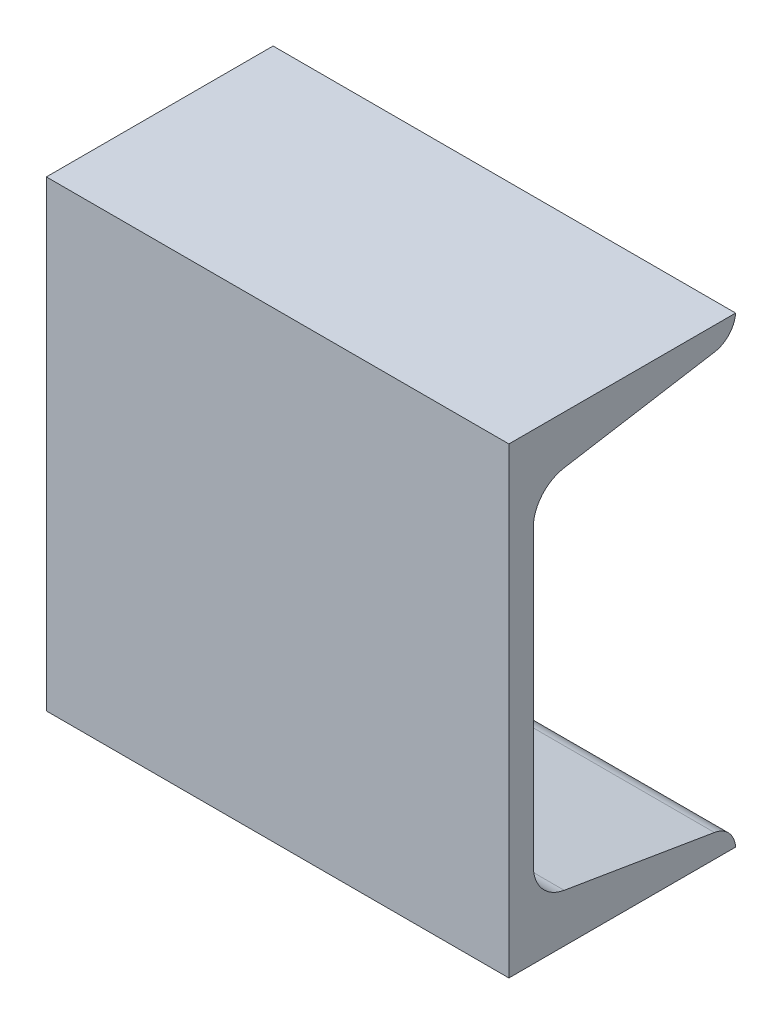
ISO-10303-21;
HEADER;
FILE_DESCRIPTION(('STEP AP214'),'2;1');
FILE_NAME('part.step','',(''),(''),'','','');
FILE_SCHEMA(('AUTOMOTIVE_DESIGN { 1 0 10303 214 1 1 1 1 }'));
ENDSEC;
DATA;
#1=APPLICATION_CONTEXT('core data for automotive mechanical design processes');
#2=APPLICATION_PROTOCOL_DEFINITION('international standard','automotive_design',2000,#1);
#3=PRODUCT_CONTEXT('',#1,'mechanical');
#4=PRODUCT('Part','Part','',(#3));
#5=PRODUCT_RELATED_PRODUCT_CATEGORY('part','',(#4));
#6=PRODUCT_DEFINITION_FORMATION('','',#4);
#7=PRODUCT_DEFINITION_CONTEXT('part definition',#1,'design');
#8=PRODUCT_DEFINITION('design','',#6,#7);
#9=PRODUCT_DEFINITION_SHAPE('','',#8);
#10=(LENGTH_UNIT() NAMED_UNIT(*) SI_UNIT(.MILLI.,.METRE.));
#11=(NAMED_UNIT(*) PLANE_ANGLE_UNIT() SI_UNIT($,.RADIAN.));
#12=(NAMED_UNIT(*) SI_UNIT($,.STERADIAN.) SOLID_ANGLE_UNIT());
#13=UNCERTAINTY_MEASURE_WITH_UNIT(LENGTH_MEASURE(1.E-05),#10,'distance_accuracy_value','');
#14=(GEOMETRIC_REPRESENTATION_CONTEXT(3) GLOBAL_UNCERTAINTY_ASSIGNED_CONTEXT((#13)) GLOBAL_UNIT_ASSIGNED_CONTEXT((#10,
#11,#12)) REPRESENTATION_CONTEXT('',''));
#15=CARTESIAN_POINT('',(0.,0.,0.));
#16=DIRECTION('',(0.,0.,1.));
#17=DIRECTION('',(1.,0.,0.));
#18=AXIS2_PLACEMENT_3D('',#15,#16,#17);
#19=CARTESIAN_POINT('',(152.4,152.4,0.));
#20=DIRECTION('',(0.,0.,-1.));
#21=DIRECTION('',(-1.,0.,0.));
#22=AXIS2_PLACEMENT_3D('',#19,#20,#21);
#23=PLANE('',#22);
#24=DIRECTION('',(0.,-1.,0.));
#25=VECTOR('',#24,1.);
#26=CARTESIAN_POINT('',(0.,152.4,0.));
#27=LINE('',#26,#25);
#28=CARTESIAN_POINT('',(0.,152.4,0.));
#29=VERTEX_POINT('',#28);
#30=CARTESIAN_POINT('',(0.,0.,0.));
#31=VERTEX_POINT('',#30);
#32=EDGE_CURVE('E11',#29,#31,#27,.T.);
#33=ORIENTED_EDGE('',*,*,#32,.T.);
#34=DIRECTION('',(-1.,0.,0.));
#35=VECTOR('',#34,1.);
#36=CARTESIAN_POINT('',(152.4,0.,0.));
#37=LINE('',#36,#35);
#38=CARTESIAN_POINT('',(152.4,0.,0.));
#39=VERTEX_POINT('',#38);
#40=EDGE_CURVE('E36',#39,#31,#37,.T.);
#41=ORIENTED_EDGE('',*,*,#40,.F.);
#42=DIRECTION('',(0.,-1.,0.));
#43=VECTOR('',#42,1.);
#44=CARTESIAN_POINT('',(152.4,152.4,0.));
#45=LINE('',#44,#43);
#46=CARTESIAN_POINT('',(152.4,152.4,0.));
#47=VERTEX_POINT('',#46);
#48=EDGE_CURVE('E110',#47,#39,#45,.T.);
#49=ORIENTED_EDGE('',*,*,#48,.F.);
#50=DIRECTION('',(-1.,0.,0.));
#51=VECTOR('',#50,1.);
#52=CARTESIAN_POINT('',(152.4,152.4,0.));
#53=LINE('',#52,#51);
#54=EDGE_CURVE('E27',#47,#29,#53,.T.);
#55=ORIENTED_EDGE('',*,*,#54,.T.);
#56=EDGE_LOOP('',(#33,#41,#49,#55));
#57=FACE_BOUND('',#56,.T.);
#58=ADVANCED_FACE('F17',(#57),#23,.F.);
#59=CARTESIAN_POINT('',(152.4,0.,-74.7014));
#60=DIRECTION('',(0.,1.,0.));
#61=DIRECTION('',(0.,0.,1.));
#62=AXIS2_PLACEMENT_3D('',#59,#60,#61);
#63=PLANE('',#62);
#64=DIRECTION('',(0.,0.,-1.));
#65=VECTOR('',#64,1.);
#66=CARTESIAN_POINT('',(0.,0.,-74.7014));
#67=LINE('',#66,#65);
#68=CARTESIAN_POINT('',(0.,0.,-74.7014));
#69=VERTEX_POINT('',#68);
#70=EDGE_CURVE('E117',#31,#69,#67,.T.);
#71=ORIENTED_EDGE('',*,*,#70,.T.);
#72=DIRECTION('',(-1.,0.,0.));
#73=VECTOR('',#72,1.);
#74=CARTESIAN_POINT('',(152.4,0.,-74.7014));
#75=LINE('',#74,#73);
#76=CARTESIAN_POINT('',(152.4,0.,-74.7014));
#77=VERTEX_POINT('',#76);
#78=EDGE_CURVE('E123',#77,#69,#75,.T.);
#79=ORIENTED_EDGE('',*,*,#78,.F.);
#80=DIRECTION('',(0.,0.,-1.));
#81=VECTOR('',#80,1.);
#82=CARTESIAN_POINT('',(152.4,0.,-74.7014));
#83=LINE('',#82,#81);
#84=EDGE_CURVE('E127',#39,#77,#83,.T.);
#85=ORIENTED_EDGE('',*,*,#84,.F.);
#86=ORIENTED_EDGE('',*,*,#40,.T.);
#87=EDGE_LOOP('',(#71,#79,#85,#86));
#88=FACE_BOUND('',#87,.T.);
#89=ADVANCED_FACE('F177',(#88),#63,.F.);
#90=CARTESIAN_POINT('',(152.4,-0.595722397390226,-66.3405962811433));
#91=DIRECTION('',(-1.,0.,0.));
#92=DIRECTION('',(0.,0.,1.));
#93=AXIS2_PLACEMENT_3D('',#90,#91,#92);
#94=CYLINDRICAL_SURFACE('',#93,8.382);
#95=CARTESIAN_POINT('',(0.,-0.595722397390226,-66.3405962811433));
#96=DIRECTION('',(1.,0.,0.));
#97=DIRECTION('',(0.,0.,-1.));
#98=AXIS2_PLACEMENT_3D('',#95,#96,#97);
#99=CIRCLE('',#98,8.382);
#100=CARTESIAN_POINT('',(0.,7.67221517035444,-67.7186864000674));
#101=VERTEX_POINT('',#100);
#102=EDGE_CURVE('E125',#69,#101,#99,.T.);
#103=ORIENTED_EDGE('',*,*,#102,.T.);
#104=DIRECTION('',(-1.,0.,0.));
#105=VECTOR('',#104,1.);
#106=CARTESIAN_POINT('',(152.4,7.67221517035444,-67.7186864000674));
#107=LINE('',#106,#105);
#108=CARTESIAN_POINT('',(152.4,7.67221517035444,-67.7186864000674));
#109=VERTEX_POINT('',#108);
#110=EDGE_CURVE('E132',#109,#101,#107,.T.);
#111=ORIENTED_EDGE('',*,*,#110,.F.);
#112=CARTESIAN_POINT('',(152.4,-0.595722397390226,-66.3405962811433));
#113=DIRECTION('',(1.,0.,0.));
#114=DIRECTION('',(0.,0.,-1.));
#115=AXIS2_PLACEMENT_3D('',#112,#113,#114);
#116=CIRCLE('',#115,8.382);
#117=EDGE_CURVE('E129',#77,#109,#116,.T.);
#118=ORIENTED_EDGE('',*,*,#117,.F.);
#119=ORIENTED_EDGE('',*,*,#78,.T.);
#120=EDGE_LOOP('',(#103,#111,#118,#119));
#121=FACE_BOUND('',#120,.T.);
#122=ADVANCED_FACE('F183',(#121),#94,.T.);
#123=CARTESIAN_POINT('',(152.4,15.9236139188236,-18.213905281565));
#124=DIRECTION('',(0.,-0.986391978972163,0.164410656039623));
#125=DIRECTION('',(0.,-0.164410656039623,-0.986391978972163));
#126=AXIS2_PLACEMENT_3D('',#123,#124,#125);
#127=PLANE('',#126);
#128=DIRECTION('',(0.,0.164410656039623,0.986391978972163));
#129=VECTOR('',#128,1.);
#130=CARTESIAN_POINT('',(0.,15.9236139188236,-18.213905281565));
#131=LINE('',#130,#129);
#132=CARTESIAN_POINT('',(0.,15.9236139188236,-18.2139052815649));
#133=VERTEX_POINT('',#132);
#134=EDGE_CURVE('E126',#101,#133,#131,.T.);
#135=ORIENTED_EDGE('',*,*,#134,.T.);
#136=DIRECTION('',(-1.,0.,0.));
#137=VECTOR('',#136,1.);
#138=CARTESIAN_POINT('',(152.4,15.9236139188236,-18.2139052815649));
#139=LINE('',#138,#137);
#140=CARTESIAN_POINT('',(152.4,15.9236139188236,-18.2139052815649));
#141=VERTEX_POINT('',#140);
#142=EDGE_CURVE('E139',#141,#133,#139,.T.);
#143=ORIENTED_EDGE('',*,*,#142,.F.);
#144=DIRECTION('',(0.,0.164410656039623,0.986391978972163));
#145=VECTOR('',#144,1.);
#146=CARTESIAN_POINT('',(152.4,15.9236139188236,-18.213905281565));
#147=LINE('',#146,#145);
#148=EDGE_CURVE('E136',#109,#141,#147,.T.);
#149=ORIENTED_EDGE('',*,*,#148,.F.);
#150=ORIENTED_EDGE('',*,*,#110,.T.);
#151=EDGE_LOOP('',(#135,#143,#149,#150));
#152=FACE_BOUND('',#151,.T.);
#153=ADVANCED_FACE('F186',(#152),#127,.F.);
#154=CARTESIAN_POINT('',(152.4,27.9497049264523,-20.2184));
#155=DIRECTION('',(-1.,0.,0.));
#156=DIRECTION('',(0.,0.,1.));
#157=AXIS2_PLACEMENT_3D('',#154,#155,#156);
#158=CYLINDRICAL_SURFACE('',#157,12.192);
#159=CARTESIAN_POINT('',(0.,27.9497049264523,-20.2184));
#160=DIRECTION('',(-1.,0.,0.));
#161=DIRECTION('',(0.,0.,-1.));
#162=AXIS2_PLACEMENT_3D('',#159,#160,#161);
#163=CIRCLE('',#162,12.192);
#164=CARTESIAN_POINT('',(0.,27.9497049264523,-8.02640000000004));
#165=VERTEX_POINT('',#164);
#166=EDGE_CURVE('E134',#133,#165,#163,.T.);
#167=ORIENTED_EDGE('',*,*,#166,.T.);
#168=DIRECTION('',(-1.,0.,0.));
#169=VECTOR('',#168,1.);
#170=CARTESIAN_POINT('',(152.4,27.9497049264523,-8.02640000000004));
#171=LINE('',#170,#169);
#172=CARTESIAN_POINT('',(152.4,27.9497049264523,-8.02640000000004));
#173=VERTEX_POINT('',#172);
#174=EDGE_CURVE('E146',#173,#165,#171,.T.);
#175=ORIENTED_EDGE('',*,*,#174,.F.);
#176=CARTESIAN_POINT('',(152.4,27.9497049264523,-20.2184));
#177=DIRECTION('',(-1.,0.,0.));
#178=DIRECTION('',(0.,0.,-1.));
#179=AXIS2_PLACEMENT_3D('',#176,#177,#178);
#180=CIRCLE('',#179,12.192);
#181=EDGE_CURVE('E143',#141,#173,#180,.T.);
#182=ORIENTED_EDGE('',*,*,#181,.F.);
#183=ORIENTED_EDGE('',*,*,#142,.T.);
#184=EDGE_LOOP('',(#167,#175,#182,#183));
#185=FACE_BOUND('',#184,.T.);
#186=ADVANCED_FACE('F191',(#185),#158,.F.);
#187=CARTESIAN_POINT('',(152.4,124.450295073548,-8.02640000000002));
#188=DIRECTION('',(0.,0.,1.));
#189=DIRECTION('',(0.,-1.,0.));
#190=AXIS2_PLACEMENT_3D('',#187,#188,#189);
#191=PLANE('',#190);
#192=DIRECTION('',(0.,1.,0.));
#193=VECTOR('',#192,1.);
#194=CARTESIAN_POINT('',(0.,124.450295073548,-8.02640000000002));
#195=LINE('',#194,#193);
#196=CARTESIAN_POINT('',(0.,124.450295073548,-8.02640000000002));
#197=VERTEX_POINT('',#196);
#198=EDGE_CURVE('E141',#165,#197,#195,.T.);
#199=ORIENTED_EDGE('',*,*,#198,.T.);
#200=DIRECTION('',(-1.,0.,0.));
#201=VECTOR('',#200,1.);
#202=CARTESIAN_POINT('',(152.4,124.450295073548,-8.02640000000002));
#203=LINE('',#202,#201);
#204=CARTESIAN_POINT('',(152.4,124.450295073548,-8.02640000000002));
#205=VERTEX_POINT('',#204);
#206=EDGE_CURVE('E153',#205,#197,#203,.T.);
#207=ORIENTED_EDGE('',*,*,#206,.F.);
#208=DIRECTION('',(0.,1.,0.));
#209=VECTOR('',#208,1.);
#210=CARTESIAN_POINT('',(152.4,124.450295073548,-8.02640000000002));
#211=LINE('',#210,#209);
#212=EDGE_CURVE('E150',#173,#205,#211,.T.);
#213=ORIENTED_EDGE('',*,*,#212,.F.);
#214=ORIENTED_EDGE('',*,*,#174,.T.);
#215=EDGE_LOOP('',(#199,#207,#213,#214));
#216=FACE_BOUND('',#215,.T.);
#217=ADVANCED_FACE('F196',(#216),#191,.F.);
#218=CARTESIAN_POINT('',(152.4,124.450295073548,-20.2184));
#219=DIRECTION('',(-1.,0.,0.));
#220=DIRECTION('',(0.,0.,1.));
#221=AXIS2_PLACEMENT_3D('',#218,#219,#220);
#222=CYLINDRICAL_SURFACE('',#221,12.192);
#223=CARTESIAN_POINT('',(0.,124.450295073548,-20.2184));
#224=DIRECTION('',(-1.,0.,0.));
#225=DIRECTION('',(0.,0.,1.));
#226=AXIS2_PLACEMENT_3D('',#223,#224,#225);
#227=CIRCLE('',#226,12.192);
#228=CARTESIAN_POINT('',(0.,136.476386081176,-18.2139052815649));
#229=VERTEX_POINT('',#228);
#230=EDGE_CURVE('E148',#197,#229,#227,.T.);
#231=ORIENTED_EDGE('',*,*,#230,.T.);
#232=DIRECTION('',(-1.,0.,0.));
#233=VECTOR('',#232,1.);
#234=CARTESIAN_POINT('',(152.4,136.476386081176,-18.2139052815649));
#235=LINE('',#234,#233);
#236=CARTESIAN_POINT('',(152.4,136.476386081176,-18.2139052815649));
#237=VERTEX_POINT('',#236);
#238=EDGE_CURVE('E160',#237,#229,#235,.T.);
#239=ORIENTED_EDGE('',*,*,#238,.F.);
#240=CARTESIAN_POINT('',(152.4,124.450295073548,-20.2184));
#241=DIRECTION('',(-1.,0.,0.));
#242=DIRECTION('',(0.,0.,1.));
#243=AXIS2_PLACEMENT_3D('',#240,#241,#242);
#244=CIRCLE('',#243,12.192);
#245=EDGE_CURVE('E157',#205,#237,#244,.T.);
#246=ORIENTED_EDGE('',*,*,#245,.F.);
#247=ORIENTED_EDGE('',*,*,#206,.T.);
#248=EDGE_LOOP('',(#231,#239,#246,#247));
#249=FACE_BOUND('',#248,.T.);
#250=ADVANCED_FACE('F199',(#249),#222,.F.);
#251=CARTESIAN_POINT('',(152.4,136.476386081176,-18.2139052815649));
#252=DIRECTION('',(0.,0.986391978972163,0.164410656039624));
#253=DIRECTION('',(0.,-0.164410656039624,0.986391978972163));
#254=AXIS2_PLACEMENT_3D('',#251,#252,#253);
#255=PLANE('',#254);
#256=DIRECTION('',(0.,0.164410656039624,-0.986391978972163));
#257=VECTOR('',#256,1.);
#258=CARTESIAN_POINT('',(0.,136.476386081176,-18.2139052815649));
#259=LINE('',#258,#257);
#260=CARTESIAN_POINT('',(0.,144.727784829646,-67.7186864000674));
#261=VERTEX_POINT('',#260);
#262=EDGE_CURVE('E155',#229,#261,#259,.T.);
#263=ORIENTED_EDGE('',*,*,#262,.T.);
#264=DIRECTION('',(-1.,0.,0.));
#265=VECTOR('',#264,1.);
#266=CARTESIAN_POINT('',(152.4,144.727784829646,-67.7186864000674));
#267=LINE('',#266,#265);
#268=CARTESIAN_POINT('',(152.4,144.727784829646,-67.7186864000674));
#269=VERTEX_POINT('',#268);
#270=EDGE_CURVE('E165',#269,#261,#267,.T.);
#271=ORIENTED_EDGE('',*,*,#270,.F.);
#272=DIRECTION('',(0.,0.164410656039624,-0.986391978972163));
#273=VECTOR('',#272,1.);
#274=CARTESIAN_POINT('',(152.4,136.476386081176,-18.2139052815649));
#275=LINE('',#274,#273);
#276=EDGE_CURVE('E101',#237,#269,#275,.T.);
#277=ORIENTED_EDGE('',*,*,#276,.F.);
#278=ORIENTED_EDGE('',*,*,#238,.T.);
#279=EDGE_LOOP('',(#263,#271,#277,#278));
#280=FACE_BOUND('',#279,.T.);
#281=ADVANCED_FACE('F170',(#280),#255,.F.);
#282=CARTESIAN_POINT('',(152.4,152.99572239739,-66.3405962811433));
#283=DIRECTION('',(-1.,0.,0.));
#284=DIRECTION('',(0.,0.,1.));
#285=AXIS2_PLACEMENT_3D('',#282,#283,#284);
#286=CYLINDRICAL_SURFACE('',#285,8.38199999999998);
#287=CARTESIAN_POINT('',(0.,152.99572239739,-66.3405962811433));
#288=DIRECTION('',(1.,0.,0.));
#289=DIRECTION('',(0.,0.,-1.));
#290=AXIS2_PLACEMENT_3D('',#287,#288,#289);
#291=CIRCLE('',#290,8.38199999999997);
#292=CARTESIAN_POINT('',(0.,152.4,-74.7014));
#293=VERTEX_POINT('',#292);
#294=EDGE_CURVE('E107',#261,#293,#291,.T.);
#295=ORIENTED_EDGE('',*,*,#294,.T.);
#296=DIRECTION('',(-1.,0.,0.));
#297=VECTOR('',#296,1.);
#298=CARTESIAN_POINT('',(152.4,152.4,-74.7014));
#299=LINE('',#298,#297);
#300=CARTESIAN_POINT('',(152.4,152.4,-74.7014));
#301=VERTEX_POINT('',#300);
#302=EDGE_CURVE('E92',#301,#293,#299,.T.);
#303=ORIENTED_EDGE('',*,*,#302,.F.);
#304=CARTESIAN_POINT('',(152.4,152.99572239739,-66.3405962811433));
#305=DIRECTION('',(1.,0.,0.));
#306=DIRECTION('',(0.,0.,-1.));
#307=AXIS2_PLACEMENT_3D('',#304,#305,#306);
#308=CIRCLE('',#307,8.38199999999997);
#309=EDGE_CURVE('E98',#269,#301,#308,.T.);
#310=ORIENTED_EDGE('',*,*,#309,.F.);
#311=ORIENTED_EDGE('',*,*,#270,.T.);
#312=EDGE_LOOP('',(#295,#303,#310,#311));
#313=FACE_BOUND('',#312,.T.);
#314=ADVANCED_FACE('F105',(#313),#286,.T.);
#315=CARTESIAN_POINT('',(152.4,152.4,-74.7014));
#316=DIRECTION('',(0.,-1.,0.));
#317=DIRECTION('',(0.,0.,-1.));
#318=AXIS2_PLACEMENT_3D('',#315,#316,#317);
#319=PLANE('',#318);
#320=DIRECTION('',(0.,0.,1.));
#321=VECTOR('',#320,1.);
#322=CARTESIAN_POINT('',(0.,152.4,-74.7014));
#323=LINE('',#322,#321);
#324=EDGE_CURVE('E109',#293,#29,#323,.T.);
#325=ORIENTED_EDGE('',*,*,#324,.T.);
#326=ORIENTED_EDGE('',*,*,#54,.F.);
#327=DIRECTION('',(0.,0.,1.));
#328=VECTOR('',#327,1.);
#329=CARTESIAN_POINT('',(152.4,152.4,-74.7014));
#330=LINE('',#329,#328);
#331=EDGE_CURVE('E21',#301,#47,#330,.T.);
#332=ORIENTED_EDGE('',*,*,#331,.F.);
#333=ORIENTED_EDGE('',*,*,#302,.T.);
#334=EDGE_LOOP('',(#325,#326,#332,#333));
#335=FACE_BOUND('',#334,.T.);
#336=ADVANCED_FACE('F113',(#335),#319,.F.);
#337=CARTESIAN_POINT('',(152.4,-0.595722397390226,-66.3405962811433));
#338=DIRECTION('',(1.,0.,0.));
#339=DIRECTION('',(0.,0.,-1.));
#340=AXIS2_PLACEMENT_3D('',#337,#338,#339);
#341=PLANE('',#340);
#342=ORIENTED_EDGE('',*,*,#48,.T.);
#343=ORIENTED_EDGE('',*,*,#84,.T.);
#344=ORIENTED_EDGE('',*,*,#117,.T.);
#345=ORIENTED_EDGE('',*,*,#148,.T.);
#346=ORIENTED_EDGE('',*,*,#181,.T.);
#347=ORIENTED_EDGE('',*,*,#212,.T.);
#348=ORIENTED_EDGE('',*,*,#245,.T.);
#349=ORIENTED_EDGE('',*,*,#276,.T.);
#350=ORIENTED_EDGE('',*,*,#309,.T.);
#351=ORIENTED_EDGE('',*,*,#331,.T.);
#352=EDGE_LOOP('',(#342,#343,#344,#345,#346,#347,#348,#349,#350,#351));
#353=FACE_BOUND('',#352,.T.);
#354=ADVANCED_FACE('F99',(#353),#341,.T.);
#355=CARTESIAN_POINT('',(0.,-0.595722397390226,-66.3405962811433));
#356=DIRECTION('',(1.,0.,0.));
#357=DIRECTION('',(0.,0.,-1.));
#358=AXIS2_PLACEMENT_3D('',#355,#356,#357);
#359=PLANE('',#358);
#360=ORIENTED_EDGE('',*,*,#32,.F.);
#361=ORIENTED_EDGE('',*,*,#324,.F.);
#362=ORIENTED_EDGE('',*,*,#294,.F.);
#363=ORIENTED_EDGE('',*,*,#262,.F.);
#364=ORIENTED_EDGE('',*,*,#230,.F.);
#365=ORIENTED_EDGE('',*,*,#198,.F.);
#366=ORIENTED_EDGE('',*,*,#166,.F.);
#367=ORIENTED_EDGE('',*,*,#134,.F.);
#368=ORIENTED_EDGE('',*,*,#102,.F.);
#369=ORIENTED_EDGE('',*,*,#70,.F.);
#370=EDGE_LOOP('',(#360,#361,#362,#363,#364,#365,#366,#367,#368,#369));
#371=FACE_BOUND('',#370,.T.);
#372=ADVANCED_FACE('F19',(#371),#359,.F.);
#373=CLOSED_SHELL('',(#58,#89,#122,#153,#186,#217,#250,#281,#314,#336,#354,#372));
#374=MANIFOLD_SOLID_BREP('B1',#373);
#375=ADVANCED_BREP_SHAPE_REPRESENTATION('',(#18,#374),#14);
#376=SHAPE_DEFINITION_REPRESENTATION(#9,#375);
ENDSEC;
END-ISO-10303-21;
